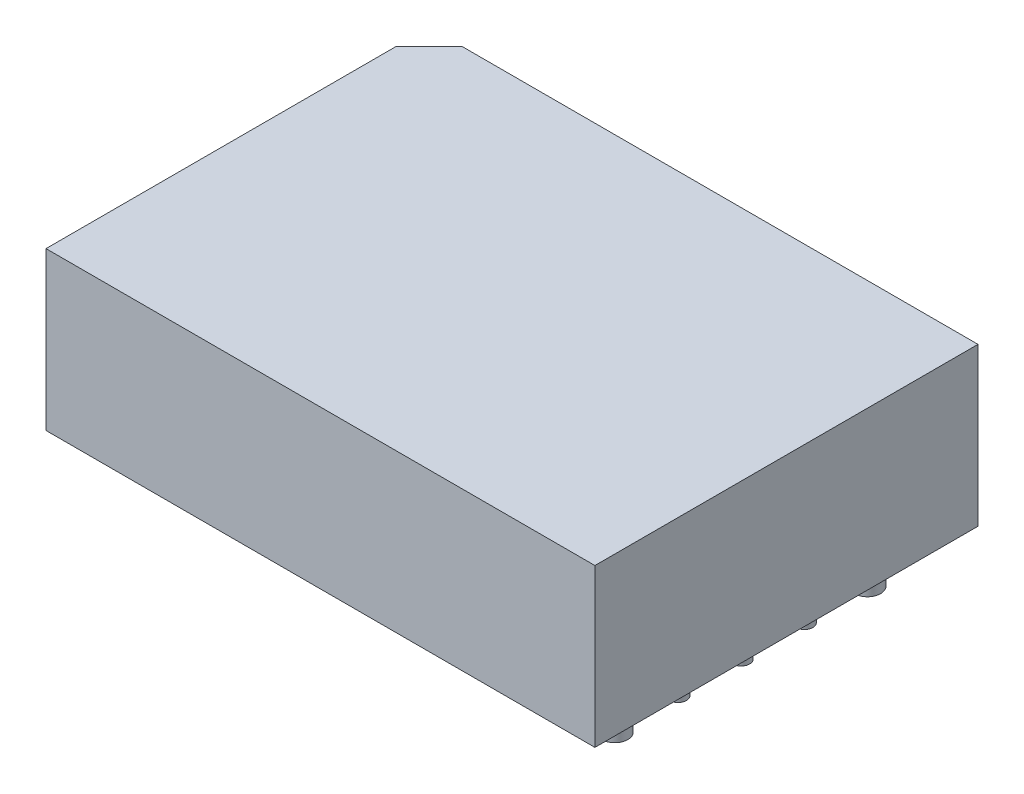
ISO-10303-21;
HEADER;
FILE_DESCRIPTION(('STEP AP214'),'2;1');
FILE_NAME('part.step','',(''),(''),'','','');
FILE_SCHEMA(('AUTOMOTIVE_DESIGN { 1 0 10303 214 1 1 1 1 }'));
ENDSEC;
DATA;
#1=APPLICATION_CONTEXT('core data for automotive mechanical design processes');
#2=APPLICATION_PROTOCOL_DEFINITION('international standard','automotive_design',2000,#1);
#3=PRODUCT_CONTEXT('',#1,'mechanical');
#4=PRODUCT('Part','Part','',(#3));
#5=PRODUCT_RELATED_PRODUCT_CATEGORY('part','',(#4));
#6=PRODUCT_DEFINITION_FORMATION('','',#4);
#7=PRODUCT_DEFINITION_CONTEXT('part definition',#1,'design');
#8=PRODUCT_DEFINITION('design','',#6,#7);
#9=PRODUCT_DEFINITION_SHAPE('','',#8);
#10=(LENGTH_UNIT() NAMED_UNIT(*) SI_UNIT(.MILLI.,.METRE.));
#11=(NAMED_UNIT(*) PLANE_ANGLE_UNIT() SI_UNIT($,.RADIAN.));
#12=(NAMED_UNIT(*) SI_UNIT($,.STERADIAN.) SOLID_ANGLE_UNIT());
#13=UNCERTAINTY_MEASURE_WITH_UNIT(LENGTH_MEASURE(1.E-05),#10,'distance_accuracy_value','');
#14=(GEOMETRIC_REPRESENTATION_CONTEXT(3) GLOBAL_UNCERTAINTY_ASSIGNED_CONTEXT((#13)) GLOBAL_UNIT_ASSIGNED_CONTEXT((#10,
#11,#12)) REPRESENTATION_CONTEXT('',''));
#15=CARTESIAN_POINT('',(0.,0.,0.));
#16=DIRECTION('',(0.,0.,1.));
#17=DIRECTION('',(1.,0.,0.));
#18=AXIS2_PLACEMENT_3D('',#15,#16,#17);
#19=CARTESIAN_POINT('',(0.,9.5,0.));
#20=DIRECTION('',(-1.,0.,0.));
#21=DIRECTION('',(0.,0.,1.));
#22=AXIS2_PLACEMENT_3D('',#19,#20,#21);
#23=PLANE('',#22);
#24=DIRECTION('',(0.,0.,-1.));
#25=VECTOR('',#24,1.);
#26=CARTESIAN_POINT('',(0.,0.,0.));
#27=LINE('',#26,#25);
#28=CARTESIAN_POINT('',(0.,0.,0.));
#29=VERTEX_POINT('',#28);
#30=CARTESIAN_POINT('',(0.,0.,-23.1));
#31=VERTEX_POINT('',#30);
#32=EDGE_CURVE('E125',#29,#31,#27,.T.);
#33=ORIENTED_EDGE('',*,*,#32,.T.);
#34=DIRECTION('',(0.,-1.,0.));
#35=VECTOR('',#34,1.);
#36=CARTESIAN_POINT('',(0.,9.5,-23.1));
#37=LINE('',#36,#35);
#38=CARTESIAN_POINT('',(0.,9.5,-23.1));
#39=VERTEX_POINT('',#38);
#40=EDGE_CURVE('E11',#39,#31,#37,.T.);
#41=ORIENTED_EDGE('',*,*,#40,.F.);
#42=DIRECTION('',(0.,0.,-1.));
#43=VECTOR('',#42,1.);
#44=CARTESIAN_POINT('',(0.,9.5,0.));
#45=LINE('',#44,#43);
#46=CARTESIAN_POINT('',(0.,9.5,0.));
#47=VERTEX_POINT('',#46);
#48=EDGE_CURVE('E139',#47,#39,#45,.T.);
#49=ORIENTED_EDGE('',*,*,#48,.F.);
#50=DIRECTION('',(0.,-1.,0.));
#51=VECTOR('',#50,1.);
#52=CARTESIAN_POINT('',(0.,9.5,0.));
#53=LINE('',#52,#51);
#54=EDGE_CURVE('E121',#47,#29,#53,.T.);
#55=ORIENTED_EDGE('',*,*,#54,.T.);
#56=EDGE_LOOP('',(#33,#41,#49,#55));
#57=FACE_BOUND('',#56,.T.);
#58=ADVANCED_FACE('F43',(#57),#23,.F.);
#59=CARTESIAN_POINT('',(0.,9.5,-23.1));
#60=DIRECTION('',(0.,0.,1.));
#61=DIRECTION('',(1.,0.,0.));
#62=AXIS2_PLACEMENT_3D('',#59,#60,#61);
#63=PLANE('',#62);
#64=DIRECTION('',(-1.,0.,0.));
#65=VECTOR('',#64,1.);
#66=CARTESIAN_POINT('',(0.,0.,-23.1));
#67=LINE('',#66,#65);
#68=CARTESIAN_POINT('',(-31.1,0.,-23.1));
#69=VERTEX_POINT('',#68);
#70=EDGE_CURVE('E129',#31,#69,#67,.T.);
#71=ORIENTED_EDGE('',*,*,#70,.T.);
#72=DIRECTION('',(0.,-1.,0.));
#73=VECTOR('',#72,1.);
#74=CARTESIAN_POINT('',(-31.1,9.5,-23.1));
#75=LINE('',#74,#73);
#76=CARTESIAN_POINT('',(-31.1,9.5,-23.1));
#77=VERTEX_POINT('',#76);
#78=EDGE_CURVE('E53',#77,#69,#75,.T.);
#79=ORIENTED_EDGE('',*,*,#78,.F.);
#80=DIRECTION('',(-1.,0.,0.));
#81=VECTOR('',#80,1.);
#82=CARTESIAN_POINT('',(0.,9.5,-23.1));
#83=LINE('',#82,#81);
#84=EDGE_CURVE('E96',#39,#77,#83,.T.);
#85=ORIENTED_EDGE('',*,*,#84,.F.);
#86=ORIENTED_EDGE('',*,*,#40,.T.);
#87=EDGE_LOOP('',(#71,#79,#85,#86));
#88=FACE_BOUND('',#87,.T.);
#89=ADVANCED_FACE('F226',(#88),#63,.F.);
#90=CARTESIAN_POINT('',(-31.1,9.5,-23.1));
#91=DIRECTION('',(0.707106781186548,0.,0.707106781186547));
#92=DIRECTION('',(0.707106781186547,0.,-0.707106781186548));
#93=AXIS2_PLACEMENT_3D('',#90,#91,#92);
#94=PLANE('',#93);
#95=DIRECTION('',(-0.707106781186547,0.,0.707106781186548));
#96=VECTOR('',#95,1.);
#97=CARTESIAN_POINT('',(-31.1,0.,-23.1));
#98=LINE('',#97,#96);
#99=CARTESIAN_POINT('',(-33.1,0.,-21.1));
#100=VERTEX_POINT('',#99);
#101=EDGE_CURVE('E112',#69,#100,#98,.T.);
#102=ORIENTED_EDGE('',*,*,#101,.T.);
#103=DIRECTION('',(0.,-1.,0.));
#104=VECTOR('',#103,1.);
#105=CARTESIAN_POINT('',(-33.1,9.5,-21.1));
#106=LINE('',#105,#104);
#107=CARTESIAN_POINT('',(-33.1,9.5,-21.1));
#108=VERTEX_POINT('',#107);
#109=EDGE_CURVE('E109',#108,#100,#106,.T.);
#110=ORIENTED_EDGE('',*,*,#109,.F.);
#111=DIRECTION('',(-0.707106781186547,0.,0.707106781186548));
#112=VECTOR('',#111,1.);
#113=CARTESIAN_POINT('',(-31.1,9.5,-23.1));
#114=LINE('',#113,#112);
#115=EDGE_CURVE('E100',#77,#108,#114,.T.);
#116=ORIENTED_EDGE('',*,*,#115,.F.);
#117=ORIENTED_EDGE('',*,*,#78,.T.);
#118=EDGE_LOOP('',(#102,#110,#116,#117));
#119=FACE_BOUND('',#118,.T.);
#120=ADVANCED_FACE('F110',(#119),#94,.F.);
#121=CARTESIAN_POINT('',(-33.1,9.5,0.));
#122=DIRECTION('',(1.,0.,0.));
#123=DIRECTION('',(0.,0.,-1.));
#124=AXIS2_PLACEMENT_3D('',#121,#122,#123);
#125=PLANE('',#124);
#126=DIRECTION('',(0.,0.,1.));
#127=VECTOR('',#126,1.);
#128=CARTESIAN_POINT('',(-33.1,0.,0.));
#129=LINE('',#128,#127);
#130=CARTESIAN_POINT('',(-33.1,0.,0.));
#131=VERTEX_POINT('',#130);
#132=EDGE_CURVE('E82',#100,#131,#129,.T.);
#133=ORIENTED_EDGE('',*,*,#132,.T.);
#134=DIRECTION('',(0.,-1.,0.));
#135=VECTOR('',#134,1.);
#136=CARTESIAN_POINT('',(-33.1,9.5,0.));
#137=LINE('',#136,#135);
#138=CARTESIAN_POINT('',(-33.1,9.5,0.));
#139=VERTEX_POINT('',#138);
#140=EDGE_CURVE('E114',#139,#131,#137,.T.);
#141=ORIENTED_EDGE('',*,*,#140,.F.);
#142=DIRECTION('',(0.,0.,1.));
#143=VECTOR('',#142,1.);
#144=CARTESIAN_POINT('',(-33.1,9.5,0.));
#145=LINE('',#144,#143);
#146=EDGE_CURVE('E104',#108,#139,#145,.T.);
#147=ORIENTED_EDGE('',*,*,#146,.F.);
#148=ORIENTED_EDGE('',*,*,#109,.T.);
#149=EDGE_LOOP('',(#133,#141,#147,#148));
#150=FACE_BOUND('',#149,.T.);
#151=ADVANCED_FACE('F116',(#150),#125,.F.);
#152=CARTESIAN_POINT('',(0.,9.5,0.));
#153=DIRECTION('',(0.,0.,-1.));
#154=DIRECTION('',(-1.,0.,0.));
#155=AXIS2_PLACEMENT_3D('',#152,#153,#154);
#156=PLANE('',#155);
#157=DIRECTION('',(1.,0.,0.));
#158=VECTOR('',#157,1.);
#159=CARTESIAN_POINT('',(0.,0.,0.));
#160=LINE('',#159,#158);
#161=EDGE_CURVE('E88',#131,#29,#160,.T.);
#162=ORIENTED_EDGE('',*,*,#161,.T.);
#163=ORIENTED_EDGE('',*,*,#54,.F.);
#164=DIRECTION('',(1.,0.,0.));
#165=VECTOR('',#164,1.);
#166=CARTESIAN_POINT('',(0.,9.5,0.));
#167=LINE('',#166,#165);
#168=EDGE_CURVE('E62',#139,#47,#167,.T.);
#169=ORIENTED_EDGE('',*,*,#168,.F.);
#170=ORIENTED_EDGE('',*,*,#140,.T.);
#171=EDGE_LOOP('',(#162,#163,#169,#170));
#172=FACE_BOUND('',#171,.T.);
#173=ADVANCED_FACE('F247',(#172),#156,.F.);
#174=CARTESIAN_POINT('',(0.,9.5,0.));
#175=DIRECTION('',(0.,1.,0.));
#176=DIRECTION('',(0.,0.,1.));
#177=AXIS2_PLACEMENT_3D('',#174,#175,#176);
#178=PLANE('',#177);
#179=ORIENTED_EDGE('',*,*,#48,.T.);
#180=ORIENTED_EDGE('',*,*,#84,.T.);
#181=ORIENTED_EDGE('',*,*,#115,.T.);
#182=ORIENTED_EDGE('',*,*,#146,.T.);
#183=ORIENTED_EDGE('',*,*,#168,.T.);
#184=EDGE_LOOP('',(#179,#180,#181,#182,#183));
#185=FACE_BOUND('',#184,.T.);
#186=ADVANCED_FACE('F102',(#185),#178,.T.);
#187=CARTESIAN_POINT('',(0.,0.,0.));
#188=DIRECTION('',(0.,1.,0.));
#189=DIRECTION('',(0.,0.,1.));
#190=AXIS2_PLACEMENT_3D('',#187,#188,#189);
#191=PLANE('',#190);
#192=CARTESIAN_POINT('',(-30.64,0.,-11.52));
#193=DIRECTION('',(0.,1.,0.));
#194=DIRECTION('',(0.,0.,1.));
#195=AXIS2_PLACEMENT_3D('',#192,#193,#194);
#196=CIRCLE('',#195,0.509999999999999);
#197=CARTESIAN_POINT('',(-30.64,0.,-11.01));
#198=VERTEX_POINT('',#197);
#199=EDGE_CURVE('E46',#198,#198,#196,.T.);
#200=ORIENTED_EDGE('',*,*,#199,.T.);
#201=EDGE_LOOP('',(#200));
#202=FACE_BOUND('',#201,.T.);
#203=CARTESIAN_POINT('',(-30.64,0.,-19.14));
#204=DIRECTION('',(0.,1.,0.));
#205=DIRECTION('',(0.,0.,1.));
#206=AXIS2_PLACEMENT_3D('',#203,#204,#205);
#207=CIRCLE('',#206,0.509999999999999);
#208=CARTESIAN_POINT('',(-30.64,0.,-18.63));
#209=VERTEX_POINT('',#208);
#210=EDGE_CURVE('E173',#209,#209,#207,.T.);
#211=ORIENTED_EDGE('',*,*,#210,.T.);
#212=EDGE_LOOP('',(#211));
#213=FACE_BOUND('',#212,.T.);
#214=CARTESIAN_POINT('',(-30.64,0.,-5.00416014924303));
#215=DIRECTION('',(0.,1.,0.));
#216=DIRECTION('',(0.,0.,1.));
#217=AXIS2_PLACEMENT_3D('',#214,#215,#216);
#218=CIRCLE('',#217,0.509999999999999);
#219=CARTESIAN_POINT('',(-30.64,0.,-4.49416014924303));
#220=VERTEX_POINT('',#219);
#221=EDGE_CURVE('E169',#220,#220,#218,.T.);
#222=ORIENTED_EDGE('',*,*,#221,.T.);
#223=EDGE_LOOP('',(#222));
#224=FACE_BOUND('',#223,.T.);
#225=CARTESIAN_POINT('',(-2.7,0.,-11.52));
#226=DIRECTION('',(0.,1.,0.));
#227=DIRECTION('',(0.,0.,1.));
#228=AXIS2_PLACEMENT_3D('',#225,#226,#227);
#229=CIRCLE('',#228,0.51);
#230=CARTESIAN_POINT('',(-2.7,0.,-11.01));
#231=VERTEX_POINT('',#230);
#232=EDGE_CURVE('E164',#231,#231,#229,.T.);
#233=ORIENTED_EDGE('',*,*,#232,.T.);
#234=EDGE_LOOP('',(#233));
#235=FACE_BOUND('',#234,.T.);
#236=CARTESIAN_POINT('',(-2.7,0.,-7.71));
#237=DIRECTION('',(0.,1.,0.));
#238=DIRECTION('',(0.,0.,1.));
#239=AXIS2_PLACEMENT_3D('',#236,#237,#238);
#240=CIRCLE('',#239,0.51);
#241=CARTESIAN_POINT('',(-2.7,0.,-7.2));
#242=VERTEX_POINT('',#241);
#243=EDGE_CURVE('E159',#242,#242,#240,.T.);
#244=ORIENTED_EDGE('',*,*,#243,.T.);
#245=EDGE_LOOP('',(#244));
#246=FACE_BOUND('',#245,.T.);
#247=CARTESIAN_POINT('',(-2.7,0.,-3.9));
#248=DIRECTION('',(0.,1.,0.));
#249=DIRECTION('',(0.,0.,1.));
#250=AXIS2_PLACEMENT_3D('',#247,#248,#249);
#251=CIRCLE('',#250,0.785);
#252=CARTESIAN_POINT('',(-2.7,0.,-3.115));
#253=VERTEX_POINT('',#252);
#254=EDGE_CURVE('E154',#253,#253,#251,.T.);
#255=ORIENTED_EDGE('',*,*,#254,.T.);
#256=EDGE_LOOP('',(#255));
#257=FACE_BOUND('',#256,.T.);
#258=CARTESIAN_POINT('',(-2.7,0.,-15.33));
#259=DIRECTION('',(0.,1.,0.));
#260=DIRECTION('',(0.,0.,1.));
#261=AXIS2_PLACEMENT_3D('',#258,#259,#260);
#262=CIRCLE('',#261,0.51);
#263=CARTESIAN_POINT('',(-2.7,0.,-14.82));
#264=VERTEX_POINT('',#263);
#265=EDGE_CURVE('E149',#264,#264,#262,.T.);
#266=ORIENTED_EDGE('',*,*,#265,.T.);
#267=EDGE_LOOP('',(#266));
#268=FACE_BOUND('',#267,.T.);
#269=CARTESIAN_POINT('',(-2.7,0.,-19.14));
#270=DIRECTION('',(0.,1.,0.));
#271=DIRECTION('',(0.,0.,1.));
#272=AXIS2_PLACEMENT_3D('',#269,#270,#271);
#273=CIRCLE('',#272,0.785);
#274=CARTESIAN_POINT('',(-2.7,0.,-18.355));
#275=VERTEX_POINT('',#274);
#276=EDGE_CURVE('E130',#275,#275,#273,.T.);
#277=ORIENTED_EDGE('',*,*,#276,.T.);
#278=EDGE_LOOP('',(#277));
#279=FACE_BOUND('',#278,.T.);
#280=ORIENTED_EDGE('',*,*,#32,.F.);
#281=ORIENTED_EDGE('',*,*,#161,.F.);
#282=ORIENTED_EDGE('',*,*,#132,.F.);
#283=ORIENTED_EDGE('',*,*,#101,.F.);
#284=ORIENTED_EDGE('',*,*,#70,.F.);
#285=EDGE_LOOP('',(#280,#281,#282,#283,#284));
#286=FACE_BOUND('',#285,.T.);
#287=ADVANCED_FACE('F235',(#202,#213,#224,#235,#246,#257,#268,#279,#286),#191,.F.);
#288=CARTESIAN_POINT('',(-2.7,-2.5,-19.14));
#289=DIRECTION('',(0.,1.,0.));
#290=DIRECTION('',(0.,0.,1.));
#291=AXIS2_PLACEMENT_3D('',#288,#289,#290);
#292=CYLINDRICAL_SURFACE('',#291,0.785);
#293=CARTESIAN_POINT('',(-2.7,-2.5,-19.14));
#294=DIRECTION('',(0.,1.,0.));
#295=DIRECTION('',(0.,0.,1.));
#296=AXIS2_PLACEMENT_3D('',#293,#294,#295);
#297=CIRCLE('',#296,0.785);
#298=CARTESIAN_POINT('',(-2.7,-2.5,-18.355));
#299=VERTEX_POINT('',#298);
#300=EDGE_CURVE('E148',#299,#299,#297,.T.);
#301=ORIENTED_EDGE('',*,*,#300,.T.);
#302=EDGE_LOOP('',(#301));
#303=FACE_BOUND('',#302,.T.);
#304=ORIENTED_EDGE('',*,*,#276,.F.);
#305=EDGE_LOOP('',(#304));
#306=FACE_BOUND('',#305,.T.);
#307=ADVANCED_FACE('F237',(#303,#306),#292,.T.);
#308=CARTESIAN_POINT('',(0.,-2.5,0.));
#309=DIRECTION('',(0.,1.,0.));
#310=DIRECTION('',(0.,0.,1.));
#311=AXIS2_PLACEMENT_3D('',#308,#309,#310);
#312=PLANE('',#311);
#313=ORIENTED_EDGE('',*,*,#300,.F.);
#314=EDGE_LOOP('',(#313));
#315=FACE_BOUND('',#314,.T.);
#316=ADVANCED_FACE('F244',(#315),#312,.F.);
#317=CARTESIAN_POINT('',(-2.7,-2.5,-15.33));
#318=DIRECTION('',(0.,1.,0.));
#319=DIRECTION('',(0.,0.,1.));
#320=AXIS2_PLACEMENT_3D('',#317,#318,#319);
#321=CYLINDRICAL_SURFACE('',#320,0.51);
#322=CARTESIAN_POINT('',(-2.7,-2.5,-15.33));
#323=DIRECTION('',(0.,1.,0.));
#324=DIRECTION('',(0.,0.,1.));
#325=AXIS2_PLACEMENT_3D('',#322,#323,#324);
#326=CIRCLE('',#325,0.51);
#327=CARTESIAN_POINT('',(-2.7,-2.5,-14.82));
#328=VERTEX_POINT('',#327);
#329=EDGE_CURVE('E153',#328,#328,#326,.T.);
#330=ORIENTED_EDGE('',*,*,#329,.T.);
#331=EDGE_LOOP('',(#330));
#332=FACE_BOUND('',#331,.T.);
#333=ORIENTED_EDGE('',*,*,#265,.F.);
#334=EDGE_LOOP('',(#333));
#335=FACE_BOUND('',#334,.T.);
#336=ADVANCED_FACE('F283',(#332,#335),#321,.T.);
#337=CARTESIAN_POINT('',(0.,-2.5,0.));
#338=DIRECTION('',(0.,1.,0.));
#339=DIRECTION('',(0.,0.,1.));
#340=AXIS2_PLACEMENT_3D('',#337,#338,#339);
#341=PLANE('',#340);
#342=ORIENTED_EDGE('',*,*,#329,.F.);
#343=EDGE_LOOP('',(#342));
#344=FACE_BOUND('',#343,.T.);
#345=ADVANCED_FACE('F292',(#344),#341,.F.);
#346=CARTESIAN_POINT('',(-2.7,-2.5,-3.9));
#347=DIRECTION('',(0.,1.,0.));
#348=DIRECTION('',(0.,0.,1.));
#349=AXIS2_PLACEMENT_3D('',#346,#347,#348);
#350=CYLINDRICAL_SURFACE('',#349,0.785);
#351=CARTESIAN_POINT('',(-2.7,-2.5,-3.9));
#352=DIRECTION('',(0.,1.,0.));
#353=DIRECTION('',(0.,0.,1.));
#354=AXIS2_PLACEMENT_3D('',#351,#352,#353);
#355=CIRCLE('',#354,0.785);
#356=CARTESIAN_POINT('',(-2.7,-2.5,-3.115));
#357=VERTEX_POINT('',#356);
#358=EDGE_CURVE('E158',#357,#357,#355,.T.);
#359=ORIENTED_EDGE('',*,*,#358,.T.);
#360=EDGE_LOOP('',(#359));
#361=FACE_BOUND('',#360,.T.);
#362=ORIENTED_EDGE('',*,*,#254,.F.);
#363=EDGE_LOOP('',(#362));
#364=FACE_BOUND('',#363,.T.);
#365=ADVANCED_FACE('F301',(#361,#364),#350,.T.);
#366=CARTESIAN_POINT('',(0.,-2.5,0.));
#367=DIRECTION('',(0.,1.,0.));
#368=DIRECTION('',(0.,0.,1.));
#369=AXIS2_PLACEMENT_3D('',#366,#367,#368);
#370=PLANE('',#369);
#371=ORIENTED_EDGE('',*,*,#358,.F.);
#372=EDGE_LOOP('',(#371));
#373=FACE_BOUND('',#372,.T.);
#374=ADVANCED_FACE('F310',(#373),#370,.F.);
#375=CARTESIAN_POINT('',(-2.7,-2.5,-7.71));
#376=DIRECTION('',(0.,1.,0.));
#377=DIRECTION('',(0.,0.,1.));
#378=AXIS2_PLACEMENT_3D('',#375,#376,#377);
#379=CYLINDRICAL_SURFACE('',#378,0.51);
#380=CARTESIAN_POINT('',(-2.7,-2.5,-7.71));
#381=DIRECTION('',(0.,1.,0.));
#382=DIRECTION('',(0.,0.,1.));
#383=AXIS2_PLACEMENT_3D('',#380,#381,#382);
#384=CIRCLE('',#383,0.51);
#385=CARTESIAN_POINT('',(-2.7,-2.5,-7.2));
#386=VERTEX_POINT('',#385);
#387=EDGE_CURVE('E163',#386,#386,#384,.T.);
#388=ORIENTED_EDGE('',*,*,#387,.T.);
#389=EDGE_LOOP('',(#388));
#390=FACE_BOUND('',#389,.T.);
#391=ORIENTED_EDGE('',*,*,#243,.F.);
#392=EDGE_LOOP('',(#391));
#393=FACE_BOUND('',#392,.T.);
#394=ADVANCED_FACE('F319',(#390,#393),#379,.T.);
#395=CARTESIAN_POINT('',(0.,-2.5,0.));
#396=DIRECTION('',(0.,1.,0.));
#397=DIRECTION('',(0.,0.,1.));
#398=AXIS2_PLACEMENT_3D('',#395,#396,#397);
#399=PLANE('',#398);
#400=ORIENTED_EDGE('',*,*,#387,.F.);
#401=EDGE_LOOP('',(#400));
#402=FACE_BOUND('',#401,.T.);
#403=ADVANCED_FACE('F328',(#402),#399,.F.);
#404=CARTESIAN_POINT('',(-2.7,-2.5,-11.52));
#405=DIRECTION('',(0.,1.,0.));
#406=DIRECTION('',(0.,0.,1.));
#407=AXIS2_PLACEMENT_3D('',#404,#405,#406);
#408=CYLINDRICAL_SURFACE('',#407,0.51);
#409=CARTESIAN_POINT('',(-2.7,-2.5,-11.52));
#410=DIRECTION('',(0.,1.,0.));
#411=DIRECTION('',(0.,0.,1.));
#412=AXIS2_PLACEMENT_3D('',#409,#410,#411);
#413=CIRCLE('',#412,0.51);
#414=CARTESIAN_POINT('',(-2.7,-2.5,-11.01));
#415=VERTEX_POINT('',#414);
#416=EDGE_CURVE('E168',#415,#415,#413,.T.);
#417=ORIENTED_EDGE('',*,*,#416,.T.);
#418=EDGE_LOOP('',(#417));
#419=FACE_BOUND('',#418,.T.);
#420=ORIENTED_EDGE('',*,*,#232,.F.);
#421=EDGE_LOOP('',(#420));
#422=FACE_BOUND('',#421,.T.);
#423=ADVANCED_FACE('F337',(#419,#422),#408,.T.);
#424=CARTESIAN_POINT('',(0.,-2.5,0.));
#425=DIRECTION('',(0.,1.,0.));
#426=DIRECTION('',(0.,0.,1.));
#427=AXIS2_PLACEMENT_3D('',#424,#425,#426);
#428=PLANE('',#427);
#429=ORIENTED_EDGE('',*,*,#416,.F.);
#430=EDGE_LOOP('',(#429));
#431=FACE_BOUND('',#430,.T.);
#432=ADVANCED_FACE('F346',(#431),#428,.F.);
#433=CARTESIAN_POINT('',(-30.64,-2.5,-5.00416014924303));
#434=DIRECTION('',(0.,1.,0.));
#435=DIRECTION('',(0.,0.,1.));
#436=AXIS2_PLACEMENT_3D('',#433,#434,#435);
#437=CYLINDRICAL_SURFACE('',#436,0.509999999999999);
#438=CARTESIAN_POINT('',(-30.64,-2.5,-5.00416014924303));
#439=DIRECTION('',(0.,1.,0.));
#440=DIRECTION('',(0.,0.,1.));
#441=AXIS2_PLACEMENT_3D('',#438,#439,#440);
#442=CIRCLE('',#441,0.509999999999999);
#443=CARTESIAN_POINT('',(-30.64,-2.5,-4.49416014924303));
#444=VERTEX_POINT('',#443);
#445=EDGE_CURVE('E172',#444,#444,#442,.T.);
#446=ORIENTED_EDGE('',*,*,#445,.T.);
#447=EDGE_LOOP('',(#446));
#448=FACE_BOUND('',#447,.T.);
#449=ORIENTED_EDGE('',*,*,#221,.F.);
#450=EDGE_LOOP('',(#449));
#451=FACE_BOUND('',#450,.T.);
#452=ADVANCED_FACE('F355',(#448,#451),#437,.T.);
#453=CARTESIAN_POINT('',(0.,-2.5,0.));
#454=DIRECTION('',(0.,1.,0.));
#455=DIRECTION('',(0.,0.,1.));
#456=AXIS2_PLACEMENT_3D('',#453,#454,#455);
#457=PLANE('',#456);
#458=ORIENTED_EDGE('',*,*,#445,.F.);
#459=EDGE_LOOP('',(#458));
#460=FACE_BOUND('',#459,.T.);
#461=ADVANCED_FACE('F364',(#460),#457,.F.);
#462=CARTESIAN_POINT('',(-30.64,-2.5,-19.14));
#463=DIRECTION('',(0.,1.,0.));
#464=DIRECTION('',(0.,0.,1.));
#465=AXIS2_PLACEMENT_3D('',#462,#463,#464);
#466=CYLINDRICAL_SURFACE('',#465,0.509999999999999);
#467=CARTESIAN_POINT('',(-30.64,-2.5,-19.14));
#468=DIRECTION('',(0.,1.,0.));
#469=DIRECTION('',(0.,0.,1.));
#470=AXIS2_PLACEMENT_3D('',#467,#468,#469);
#471=CIRCLE('',#470,0.509999999999999);
#472=CARTESIAN_POINT('',(-30.64,-2.5,-18.63));
#473=VERTEX_POINT('',#472);
#474=EDGE_CURVE('E176',#473,#473,#471,.T.);
#475=ORIENTED_EDGE('',*,*,#474,.T.);
#476=EDGE_LOOP('',(#475));
#477=FACE_BOUND('',#476,.T.);
#478=ORIENTED_EDGE('',*,*,#210,.F.);
#479=EDGE_LOOP('',(#478));
#480=FACE_BOUND('',#479,.T.);
#481=ADVANCED_FACE('F373',(#477,#480),#466,.T.);
#482=CARTESIAN_POINT('',(0.,-2.5,0.));
#483=DIRECTION('',(0.,1.,0.));
#484=DIRECTION('',(0.,0.,1.));
#485=AXIS2_PLACEMENT_3D('',#482,#483,#484);
#486=PLANE('',#485);
#487=ORIENTED_EDGE('',*,*,#474,.F.);
#488=EDGE_LOOP('',(#487));
#489=FACE_BOUND('',#488,.T.);
#490=ADVANCED_FACE('F222',(#489),#486,.F.);
#491=CARTESIAN_POINT('',(-30.64,-2.5,-11.52));
#492=DIRECTION('',(0.,1.,0.));
#493=DIRECTION('',(0.,0.,1.));
#494=AXIS2_PLACEMENT_3D('',#491,#492,#493);
#495=CYLINDRICAL_SURFACE('',#494,0.509999999999999);
#496=CARTESIAN_POINT('',(-30.64,-2.5,-11.52));
#497=DIRECTION('',(0.,1.,0.));
#498=DIRECTION('',(0.,0.,1.));
#499=AXIS2_PLACEMENT_3D('',#496,#497,#498);
#500=CIRCLE('',#499,0.509999999999999);
#501=CARTESIAN_POINT('',(-30.64,-2.5,-11.01));
#502=VERTEX_POINT('',#501);
#503=EDGE_CURVE('E190',#502,#502,#500,.T.);
#504=ORIENTED_EDGE('',*,*,#503,.T.);
#505=EDGE_LOOP('',(#504));
#506=FACE_BOUND('',#505,.T.);
#507=ORIENTED_EDGE('',*,*,#199,.F.);
#508=EDGE_LOOP('',(#507));
#509=FACE_BOUND('',#508,.T.);
#510=ADVANCED_FACE('F213',(#506,#509),#495,.T.);
#511=CARTESIAN_POINT('',(-30.64,-2.5,-11.52));
#512=DIRECTION('',(0.,1.,0.));
#513=DIRECTION('',(0.,0.,1.));
#514=AXIS2_PLACEMENT_3D('',#511,#512,#513);
#515=PLANE('',#514);
#516=ORIENTED_EDGE('',*,*,#503,.F.);
#517=EDGE_LOOP('',(#516));
#518=FACE_BOUND('',#517,.T.);
#519=ADVANCED_FACE('F216',(#518),#515,.F.);
#520=CLOSED_SHELL('',(#58,#89,#120,#151,#173,#186,#287,#307,#316,#336,#345,#365,#374,#394,#403,
#423,#432,#452,#461,#481,#490,#510,#519));
#521=MANIFOLD_SOLID_BREP('B2',#520);
#522=ADVANCED_BREP_SHAPE_REPRESENTATION('',(#18,#521),#14);
#523=SHAPE_DEFINITION_REPRESENTATION(#9,#522);
ENDSEC;
END-ISO-10303-21;
